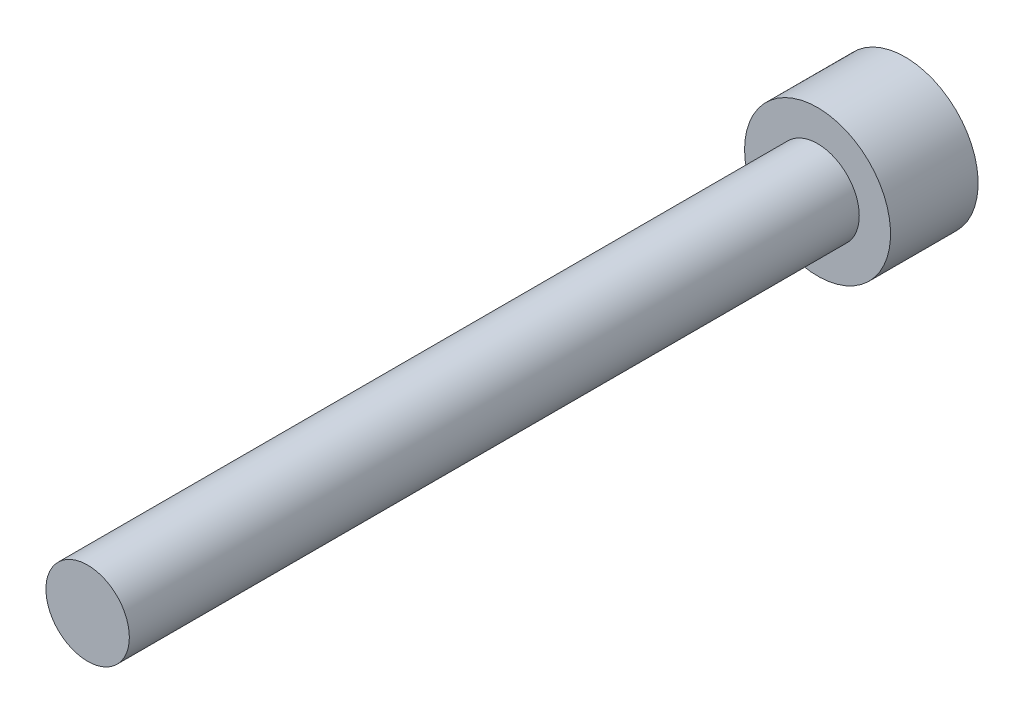
ISO-10303-21;
HEADER;
FILE_DESCRIPTION(('STEP AP214'),'2;1');
FILE_NAME('part.step','',(''),(''),'','','');
FILE_SCHEMA(('AUTOMOTIVE_DESIGN { 1 0 10303 214 1 1 1 1 }'));
ENDSEC;
DATA;
#1=APPLICATION_CONTEXT('core data for automotive mechanical design processes');
#2=APPLICATION_PROTOCOL_DEFINITION('international standard','automotive_design',2000,#1);
#3=PRODUCT_CONTEXT('',#1,'mechanical');
#4=PRODUCT('Part','Part','',(#3));
#5=PRODUCT_RELATED_PRODUCT_CATEGORY('part','',(#4));
#6=PRODUCT_DEFINITION_FORMATION('','',#4);
#7=PRODUCT_DEFINITION_CONTEXT('part definition',#1,'design');
#8=PRODUCT_DEFINITION('design','',#6,#7);
#9=PRODUCT_DEFINITION_SHAPE('','',#8);
#10=(LENGTH_UNIT() NAMED_UNIT(*) SI_UNIT(.MILLI.,.METRE.));
#11=(NAMED_UNIT(*) PLANE_ANGLE_UNIT() SI_UNIT($,.RADIAN.));
#12=(NAMED_UNIT(*) SI_UNIT($,.STERADIAN.) SOLID_ANGLE_UNIT());
#13=UNCERTAINTY_MEASURE_WITH_UNIT(LENGTH_MEASURE(1.E-05),#10,'distance_accuracy_value','');
#14=(GEOMETRIC_REPRESENTATION_CONTEXT(3) GLOBAL_UNCERTAINTY_ASSIGNED_CONTEXT((#13)) GLOBAL_UNIT_ASSIGNED_CONTEXT((#10,
#11,#12)) REPRESENTATION_CONTEXT('',''));
#15=CARTESIAN_POINT('',(0.,0.,0.));
#16=DIRECTION('',(0.,0.,1.));
#17=DIRECTION('',(1.,0.,0.));
#18=AXIS2_PLACEMENT_3D('',#15,#16,#17);
#19=CARTESIAN_POINT('',(0.,0.,35.));
#20=DIRECTION('',(0.,0.,-1.));
#21=DIRECTION('',(-1.,0.,0.));
#22=AXIS2_PLACEMENT_3D('',#19,#20,#21);
#23=CYLINDRICAL_SURFACE('',#22,2.);
#24=CARTESIAN_POINT('',(0.,0.,35.));
#25=DIRECTION('',(0.,0.,1.));
#26=DIRECTION('',(1.,0.,0.));
#27=AXIS2_PLACEMENT_3D('',#24,#25,#26);
#28=CIRCLE('',#27,2.);
#29=CARTESIAN_POINT('',(2.,0.,35.));
#30=VERTEX_POINT('',#29);
#31=EDGE_CURVE('E10',#30,#30,#28,.T.);
#32=ORIENTED_EDGE('',*,*,#31,.F.);
#33=EDGE_LOOP('',(#32));
#34=FACE_BOUND('',#33,.T.);
#35=CARTESIAN_POINT('',(0.,0.,0.));
#36=DIRECTION('',(0.,0.,1.));
#37=DIRECTION('',(1.,0.,0.));
#38=AXIS2_PLACEMENT_3D('',#35,#36,#37);
#39=CIRCLE('',#38,2.);
#40=CARTESIAN_POINT('',(2.,0.,0.));
#41=VERTEX_POINT('',#40);
#42=EDGE_CURVE('E34',#41,#41,#39,.T.);
#43=ORIENTED_EDGE('',*,*,#42,.T.);
#44=EDGE_LOOP('',(#43));
#45=FACE_BOUND('',#44,.T.);
#46=ADVANCED_FACE('F31',(#34,#45),#23,.T.);
#47=CARTESIAN_POINT('',(0.,0.,35.));
#48=DIRECTION('',(0.,0.,1.));
#49=DIRECTION('',(1.,0.,0.));
#50=AXIS2_PLACEMENT_3D('',#47,#48,#49);
#51=PLANE('',#50);
#52=ORIENTED_EDGE('',*,*,#31,.T.);
#53=EDGE_LOOP('',(#52));
#54=FACE_BOUND('',#53,.T.);
#55=ADVANCED_FACE('F54',(#54),#51,.T.);
#56=CARTESIAN_POINT('',(0.,0.,-4.2));
#57=DIRECTION('',(0.,0.,1.));
#58=DIRECTION('',(1.,0.,0.));
#59=AXIS2_PLACEMENT_3D('',#56,#57,#58);
#60=CYLINDRICAL_SURFACE('',#59,3.5);
#61=CARTESIAN_POINT('',(0.,0.,-4.2));
#62=DIRECTION('',(0.,0.,-1.));
#63=DIRECTION('',(-1.,0.,0.));
#64=AXIS2_PLACEMENT_3D('',#61,#62,#63);
#65=CIRCLE('',#64,3.5);
#66=CARTESIAN_POINT('',(-3.5,0.,-4.2));
#67=VERTEX_POINT('',#66);
#68=EDGE_CURVE('E41',#67,#67,#65,.T.);
#69=ORIENTED_EDGE('',*,*,#68,.F.);
#70=EDGE_LOOP('',(#69));
#71=FACE_BOUND('',#70,.T.);
#72=CARTESIAN_POINT('',(0.,0.,0.));
#73=DIRECTION('',(0.,0.,-1.));
#74=DIRECTION('',(-1.,0.,0.));
#75=AXIS2_PLACEMENT_3D('',#72,#73,#74);
#76=CIRCLE('',#75,3.5);
#77=CARTESIAN_POINT('',(-3.5,0.,0.));
#78=VERTEX_POINT('',#77);
#79=EDGE_CURVE('E43',#78,#78,#76,.T.);
#80=ORIENTED_EDGE('',*,*,#79,.T.);
#81=EDGE_LOOP('',(#80));
#82=FACE_BOUND('',#81,.T.);
#83=ADVANCED_FACE('F51',(#71,#82),#60,.T.);
#84=CARTESIAN_POINT('',(0.,0.,-4.2));
#85=DIRECTION('',(0.,0.,-1.));
#86=DIRECTION('',(-1.,0.,0.));
#87=AXIS2_PLACEMENT_3D('',#84,#85,#86);
#88=PLANE('',#87);
#89=ORIENTED_EDGE('',*,*,#68,.T.);
#90=EDGE_LOOP('',(#89));
#91=FACE_BOUND('',#90,.T.);
#92=ADVANCED_FACE('F49',(#91),#88,.T.);
#93=CARTESIAN_POINT('',(0.,0.,0.));
#94=DIRECTION('',(0.,0.,-1.));
#95=DIRECTION('',(-1.,0.,0.));
#96=AXIS2_PLACEMENT_3D('',#93,#94,#95);
#97=PLANE('',#96);
#98=ORIENTED_EDGE('',*,*,#42,.F.);
#99=EDGE_LOOP('',(#98));
#100=FACE_BOUND('',#99,.T.);
#101=ORIENTED_EDGE('',*,*,#79,.F.);
#102=EDGE_LOOP('',(#101));
#103=FACE_BOUND('',#102,.T.);
#104=ADVANCED_FACE('F58',(#100,#103),#97,.F.);
#105=CLOSED_SHELL('',(#46,#55,#83,#92,#104));
#106=MANIFOLD_SOLID_BREP('B2',#105);
#107=ADVANCED_BREP_SHAPE_REPRESENTATION('',(#18,#106),#14);
#108=SHAPE_DEFINITION_REPRESENTATION(#9,#107);
ENDSEC;
END-ISO-10303-21;
